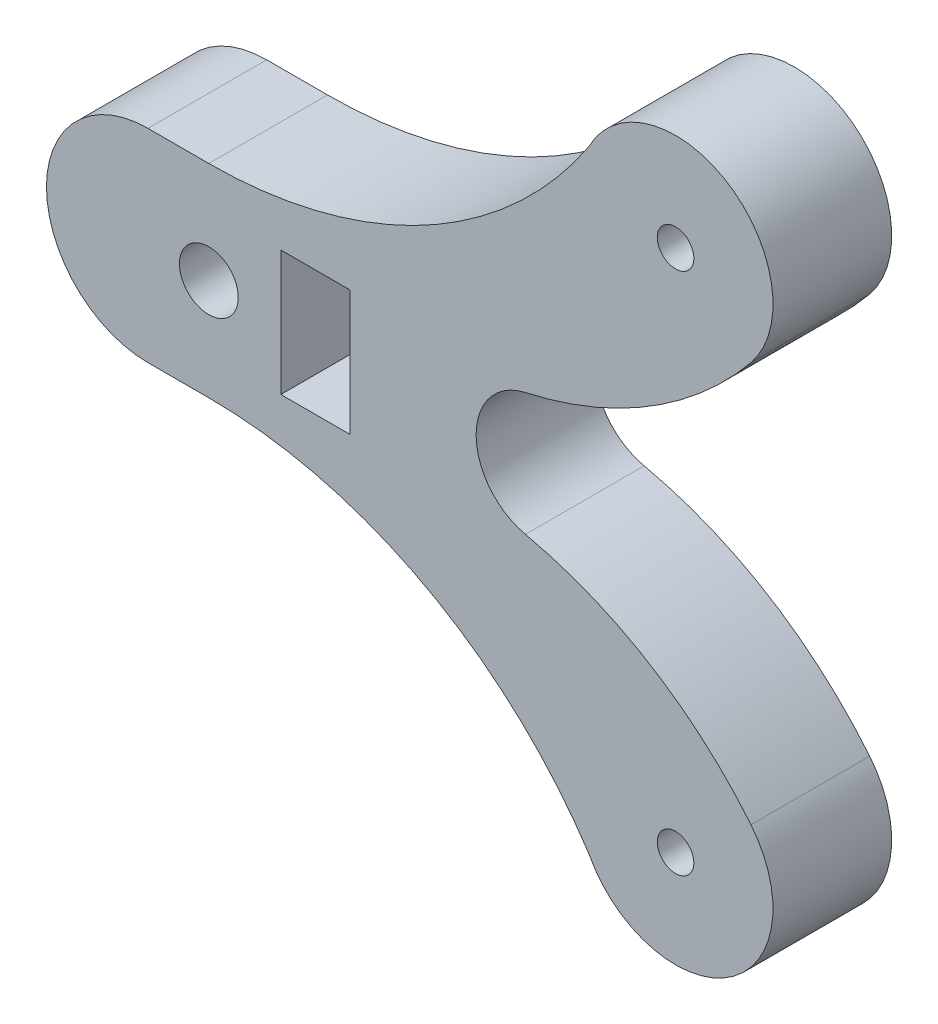
ISO-10303-21;
HEADER;
FILE_DESCRIPTION(('STEP AP214'),'2;1');
FILE_NAME('part.step','',(''),(''),'','','');
FILE_SCHEMA(('AUTOMOTIVE_DESIGN { 1 0 10303 214 1 1 1 1 }'));
ENDSEC;
DATA;
#1=APPLICATION_CONTEXT('core data for automotive mechanical design processes');
#2=APPLICATION_PROTOCOL_DEFINITION('international standard','automotive_design',2000,#1);
#3=PRODUCT_CONTEXT('',#1,'mechanical');
#4=PRODUCT('Part','Part','',(#3));
#5=PRODUCT_RELATED_PRODUCT_CATEGORY('part','',(#4));
#6=PRODUCT_DEFINITION_FORMATION('','',#4);
#7=PRODUCT_DEFINITION_CONTEXT('part definition',#1,'design');
#8=PRODUCT_DEFINITION('design','',#6,#7);
#9=PRODUCT_DEFINITION_SHAPE('','',#8);
#10=(LENGTH_UNIT() NAMED_UNIT(*) SI_UNIT(.MILLI.,.METRE.));
#11=(NAMED_UNIT(*) PLANE_ANGLE_UNIT() SI_UNIT($,.RADIAN.));
#12=(NAMED_UNIT(*) SI_UNIT($,.STERADIAN.) SOLID_ANGLE_UNIT());
#13=UNCERTAINTY_MEASURE_WITH_UNIT(LENGTH_MEASURE(1.E-05),#10,'distance_accuracy_value','');
#14=(GEOMETRIC_REPRESENTATION_CONTEXT(3) GLOBAL_UNCERTAINTY_ASSIGNED_CONTEXT((#13)) GLOBAL_UNIT_ASSIGNED_CONTEXT((#10,
#11,#12)) REPRESENTATION_CONTEXT('',''));
#15=CARTESIAN_POINT('',(0.,0.,0.));
#16=DIRECTION('',(0.,0.,1.));
#17=DIRECTION('',(1.,0.,0.));
#18=AXIS2_PLACEMENT_3D('',#15,#16,#17);
#19=CARTESIAN_POINT('',(588.919699582057,407.939803553498,5.85));
#20=DIRECTION('',(0.,0.,-1.));
#21=DIRECTION('',(-1.,0.,0.));
#22=AXIS2_PLACEMENT_3D('',#19,#20,#21);
#23=PLANE('',#22);
#24=CARTESIAN_POINT('',(588.919699582057,435.365819013464,5.85));
#25=DIRECTION('',(0.,0.,1.));
#26=DIRECTION('',(1.,0.,0.));
#27=AXIS2_PLACEMENT_3D('',#24,#25,#26);
#28=CIRCLE('',#27,1.44981300000002);
#29=CARTESIAN_POINT('',(590.369512582057,435.365819013464,5.85));
#30=VERTEX_POINT('',#29);
#31=EDGE_CURVE('E172',#30,#30,#28,.T.);
#32=ORIENTED_EDGE('',*,*,#31,.F.);
#33=EDGE_LOOP('',(#32));
#34=FACE_BOUND('',#33,.T.);
#35=CARTESIAN_POINT('',(611.919699582057,422.465819013464,5.85));
#36=DIRECTION('',(0.,0.,1.));
#37=DIRECTION('',(1.,0.,0.));
#38=AXIS2_PLACEMENT_3D('',#35,#36,#37);
#39=CIRCLE('',#38,0.900000000000007);
#40=CARTESIAN_POINT('',(612.819699582057,422.465819013464,5.85));
#41=VERTEX_POINT('',#40);
#42=EDGE_CURVE('E178',#41,#41,#39,.T.);
#43=ORIENTED_EDGE('',*,*,#42,.F.);
#44=EDGE_LOOP('',(#43));
#45=FACE_BOUND('',#44,.T.);
#46=CARTESIAN_POINT('',(611.919699582057,448.265819013464,5.85));
#47=DIRECTION('',(0.,0.,1.));
#48=DIRECTION('',(1.,0.,0.));
#49=AXIS2_PLACEMENT_3D('',#46,#47,#48);
#50=CIRCLE('',#49,0.900000000000007);
#51=CARTESIAN_POINT('',(612.819699582057,448.265819013464,5.85));
#52=VERTEX_POINT('',#51);
#53=EDGE_CURVE('E184',#52,#52,#50,.T.);
#54=ORIENTED_EDGE('',*,*,#53,.F.);
#55=EDGE_LOOP('',(#54));
#56=FACE_BOUND('',#55,.T.);
#57=CARTESIAN_POINT('',(588.919699582057,407.939803553498,5.85));
#58=DIRECTION('',(0.,0.,-1.));
#59=DIRECTION('',(-1.,0.,0.));
#60=AXIS2_PLACEMENT_3D('',#57,#58,#59);
#61=CIRCLE('',#60,22.4260154599657);
#62=CARTESIAN_POINT('',(588.919699582057,430.365819013464,5.85));
#63=VERTEX_POINT('',#62);
#64=CARTESIAN_POINT('',(607.649897060832,420.272924481175,5.85));
#65=VERTEX_POINT('',#64);
#66=EDGE_CURVE('E190',#63,#65,#61,.T.);
#67=ORIENTED_EDGE('',*,*,#66,.T.);
#68=CARTESIAN_POINT('',(611.919699582057,422.465819013464,5.85));
#69=DIRECTION('',(0.,0.,1.));
#70=DIRECTION('',(1.,0.,0.));
#71=AXIS2_PLACEMENT_3D('',#68,#69,#70);
#72=CIRCLE('',#71,4.79999999999999);
#73=CARTESIAN_POINT('',(615.634267587279,425.505882258625,5.85));
#74=VERTEX_POINT('',#73);
#75=EDGE_CURVE('E193',#65,#74,#72,.T.);
#76=ORIENTED_EDGE('',*,*,#75,.T.);
#77=CARTESIAN_POINT('',(600.219995385918,412.890589631222,5.85));
#78=DIRECTION('',(0.,0.,1.));
#79=DIRECTION('',(-1.,0.,0.));
#80=AXIS2_PLACEMENT_3D('',#77,#78,#79);
#81=CIRCLE('',#80,19.9184687055168);
#82=CARTESIAN_POINT('',(604.521800573852,432.338979479683,5.85));
#83=VERTEX_POINT('',#82);
#84=EDGE_CURVE('E196',#74,#83,#81,.T.);
#85=ORIENTED_EDGE('',*,*,#84,.T.);
#86=CARTESIAN_POINT('',(605.191309675167,435.365819013464,5.85));
#87=DIRECTION('',(0.,0.,-1.));
#88=DIRECTION('',(1.,0.,0.));
#89=AXIS2_PLACEMENT_3D('',#86,#87,#88);
#90=CIRCLE('',#89,3.09999999999995);
#91=CARTESIAN_POINT('',(604.521800573852,438.392658547244,5.85));
#92=VERTEX_POINT('',#91);
#93=EDGE_CURVE('E198',#83,#92,#90,.T.);
#94=ORIENTED_EDGE('',*,*,#93,.T.);
#95=CARTESIAN_POINT('',(600.219995385918,457.841048395705,5.85));
#96=DIRECTION('',(0.,0.,1.));
#97=DIRECTION('',(1.,0.,0.));
#98=AXIS2_PLACEMENT_3D('',#95,#96,#97);
#99=CIRCLE('',#98,19.9184687055169);
#100=CARTESIAN_POINT('',(615.634267587279,445.225755768303,5.85));
#101=VERTEX_POINT('',#100);
#102=EDGE_CURVE('E200',#92,#101,#99,.T.);
#103=ORIENTED_EDGE('',*,*,#102,.T.);
#104=CARTESIAN_POINT('',(611.919699582057,448.265819013464,5.85));
#105=DIRECTION('',(0.,0.,1.));
#106=DIRECTION('',(-1.,0.,0.));
#107=AXIS2_PLACEMENT_3D('',#104,#105,#106);
#108=CIRCLE('',#107,4.80000000000001);
#109=CARTESIAN_POINT('',(607.649897060832,450.458713545752,5.85));
#110=VERTEX_POINT('',#109);
#111=EDGE_CURVE('E202',#101,#110,#108,.T.);
#112=ORIENTED_EDGE('',*,*,#111,.T.);
#113=CARTESIAN_POINT('',(588.919699582057,462.79183447343,5.85));
#114=DIRECTION('',(0.,0.,-1.));
#115=DIRECTION('',(1.,0.,0.));
#116=AXIS2_PLACEMENT_3D('',#113,#114,#115);
#117=CIRCLE('',#116,22.4260154599657);
#118=CARTESIAN_POINT('',(588.919699582057,440.365819013464,5.85));
#119=VERTEX_POINT('',#118);
#120=EDGE_CURVE('E204',#110,#119,#117,.T.);
#121=ORIENTED_EDGE('',*,*,#120,.T.);
#122=DIRECTION('',(-1.,0.,0.));
#123=VECTOR('',#122,1.);
#124=CARTESIAN_POINT('',(588.919699582057,440.365819013464,5.85));
#125=LINE('',#124,#123);
#126=CARTESIAN_POINT('',(585.919699582057,440.365819013464,5.85));
#127=VERTEX_POINT('',#126);
#128=EDGE_CURVE('E206',#119,#127,#125,.T.);
#129=ORIENTED_EDGE('',*,*,#128,.T.);
#130=CARTESIAN_POINT('',(585.919699582057,435.365819013464,5.85));
#131=DIRECTION('',(0.,0.,1.));
#132=DIRECTION('',(1.,0.,0.));
#133=AXIS2_PLACEMENT_3D('',#130,#131,#132);
#134=CIRCLE('',#133,5.);
#135=CARTESIAN_POINT('',(585.919699582057,430.365819013464,5.85));
#136=VERTEX_POINT('',#135);
#137=EDGE_CURVE('E208',#127,#136,#134,.T.);
#138=ORIENTED_EDGE('',*,*,#137,.T.);
#139=DIRECTION('',(1.,0.,0.));
#140=VECTOR('',#139,1.);
#141=CARTESIAN_POINT('',(588.919699582057,430.365819013464,5.85));
#142=LINE('',#141,#140);
#143=EDGE_CURVE('E210',#136,#63,#142,.T.);
#144=ORIENTED_EDGE('',*,*,#143,.T.);
#145=EDGE_LOOP('',(#67,#76,#85,#94,#103,#112,#121,#129,#138,#144));
#146=FACE_BOUND('',#145,.T.);
#147=DIRECTION('',(0.,-1.,0.));
#148=VECTOR('',#147,1.);
#149=CARTESIAN_POINT('',(592.469512582057,432.283319013464,5.85));
#150=LINE('',#149,#148);
#151=CARTESIAN_POINT('',(592.469512582057,438.448319013464,5.85));
#152=VERTEX_POINT('',#151);
#153=CARTESIAN_POINT('',(592.469512582057,432.283319013464,5.85));
#154=VERTEX_POINT('',#153);
#155=EDGE_CURVE('E136',#152,#154,#150,.T.);
#156=ORIENTED_EDGE('',*,*,#155,.F.);
#157=DIRECTION('',(-1.,0.,0.));
#158=VECTOR('',#157,1.);
#159=CARTESIAN_POINT('',(592.469512582057,438.448319013464,5.85));
#160=LINE('',#159,#158);
#161=CARTESIAN_POINT('',(595.869523582057,438.448319013464,5.85));
#162=VERTEX_POINT('',#161);
#163=EDGE_CURVE('E158',#162,#152,#160,.T.);
#164=ORIENTED_EDGE('',*,*,#163,.F.);
#165=DIRECTION('',(0.,1.,0.));
#166=VECTOR('',#165,1.);
#167=CARTESIAN_POINT('',(595.869523582057,438.448319013464,5.85));
#168=LINE('',#167,#166);
#169=CARTESIAN_POINT('',(595.869523582057,432.283319013464,5.85));
#170=VERTEX_POINT('',#169);
#171=EDGE_CURVE('E156',#170,#162,#168,.T.);
#172=ORIENTED_EDGE('',*,*,#171,.F.);
#173=DIRECTION('',(1.,0.,0.));
#174=VECTOR('',#173,1.);
#175=CARTESIAN_POINT('',(595.869523582057,432.283319013464,5.85));
#176=LINE('',#175,#174);
#177=EDGE_CURVE('E144',#154,#170,#176,.T.);
#178=ORIENTED_EDGE('',*,*,#177,.F.);
#179=EDGE_LOOP('',(#156,#164,#172,#178));
#180=FACE_BOUND('',#179,.T.);
#181=ADVANCED_FACE('F35',(#34,#45,#56,#146,#180),#23,.F.);
#182=CARTESIAN_POINT('',(588.919699582057,407.939803553498,0.));
#183=DIRECTION('',(0.,0.,-1.));
#184=DIRECTION('',(-1.,0.,0.));
#185=AXIS2_PLACEMENT_3D('',#182,#183,#184);
#186=PLANE('',#185);
#187=CARTESIAN_POINT('',(611.919699582057,422.465819013464,0.));
#188=DIRECTION('',(0.,0.,1.));
#189=DIRECTION('',(1.,0.,0.));
#190=AXIS2_PLACEMENT_3D('',#187,#188,#189);
#191=CIRCLE('',#190,0.900000000000007);
#192=CARTESIAN_POINT('',(612.819699582057,422.465819013464,0.));
#193=VERTEX_POINT('',#192);
#194=EDGE_CURVE('E175',#193,#193,#191,.T.);
#195=ORIENTED_EDGE('',*,*,#194,.T.);
#196=EDGE_LOOP('',(#195));
#197=FACE_BOUND('',#196,.T.);
#198=CARTESIAN_POINT('',(588.919699582057,407.939803553498,0.));
#199=DIRECTION('',(0.,0.,-1.));
#200=DIRECTION('',(-1.,0.,0.));
#201=AXIS2_PLACEMENT_3D('',#198,#199,#200);
#202=CIRCLE('',#201,22.4260154599657);
#203=CARTESIAN_POINT('',(588.919699582057,430.365819013464,0.));
#204=VERTEX_POINT('',#203);
#205=CARTESIAN_POINT('',(607.649897060832,420.272924481175,0.));
#206=VERTEX_POINT('',#205);
#207=EDGE_CURVE('E187',#204,#206,#202,.T.);
#208=ORIENTED_EDGE('',*,*,#207,.F.);
#209=DIRECTION('',(1.,0.,0.));
#210=VECTOR('',#209,1.);
#211=CARTESIAN_POINT('',(588.919699582057,430.365819013464,0.));
#212=LINE('',#211,#210);
#213=CARTESIAN_POINT('',(585.919699582057,430.365819013464,0.));
#214=VERTEX_POINT('',#213);
#215=EDGE_CURVE('E194',#214,#204,#212,.T.);
#216=ORIENTED_EDGE('',*,*,#215,.F.);
#217=CARTESIAN_POINT('',(585.919699582057,435.365819013464,0.));
#218=DIRECTION('',(0.,0.,1.));
#219=DIRECTION('',(1.,0.,0.));
#220=AXIS2_PLACEMENT_3D('',#217,#218,#219);
#221=CIRCLE('',#220,5.);
#222=CARTESIAN_POINT('',(585.919699582057,440.365819013464,0.));
#223=VERTEX_POINT('',#222);
#224=EDGE_CURVE('E229',#223,#214,#221,.T.);
#225=ORIENTED_EDGE('',*,*,#224,.F.);
#226=DIRECTION('',(-1.,0.,0.));
#227=VECTOR('',#226,1.);
#228=CARTESIAN_POINT('',(588.919699582057,440.365819013464,0.));
#229=LINE('',#228,#227);
#230=CARTESIAN_POINT('',(588.919699582057,440.365819013464,0.));
#231=VERTEX_POINT('',#230);
#232=EDGE_CURVE('E227',#231,#223,#229,.T.);
#233=ORIENTED_EDGE('',*,*,#232,.F.);
#234=CARTESIAN_POINT('',(588.919699582057,462.79183447343,0.));
#235=DIRECTION('',(0.,0.,-1.));
#236=DIRECTION('',(1.,0.,0.));
#237=AXIS2_PLACEMENT_3D('',#234,#235,#236);
#238=CIRCLE('',#237,22.4260154599657);
#239=CARTESIAN_POINT('',(607.649897060832,450.458713545752,0.));
#240=VERTEX_POINT('',#239);
#241=EDGE_CURVE('E225',#240,#231,#238,.T.);
#242=ORIENTED_EDGE('',*,*,#241,.F.);
#243=CARTESIAN_POINT('',(611.919699582057,448.265819013464,0.));
#244=DIRECTION('',(0.,0.,1.));
#245=DIRECTION('',(-1.,0.,0.));
#246=AXIS2_PLACEMENT_3D('',#243,#244,#245);
#247=CIRCLE('',#246,4.80000000000001);
#248=CARTESIAN_POINT('',(615.634267587279,445.225755768303,0.));
#249=VERTEX_POINT('',#248);
#250=EDGE_CURVE('E223',#249,#240,#247,.T.);
#251=ORIENTED_EDGE('',*,*,#250,.F.);
#252=CARTESIAN_POINT('',(600.219995385918,457.841048395705,0.));
#253=DIRECTION('',(0.,0.,1.));
#254=DIRECTION('',(1.,0.,0.));
#255=AXIS2_PLACEMENT_3D('',#252,#253,#254);
#256=CIRCLE('',#255,19.9184687055169);
#257=CARTESIAN_POINT('',(604.521800573852,438.392658547244,0.));
#258=VERTEX_POINT('',#257);
#259=EDGE_CURVE('E221',#258,#249,#256,.T.);
#260=ORIENTED_EDGE('',*,*,#259,.F.);
#261=CARTESIAN_POINT('',(605.191309675167,435.365819013464,0.));
#262=DIRECTION('',(0.,0.,-1.));
#263=DIRECTION('',(1.,0.,0.));
#264=AXIS2_PLACEMENT_3D('',#261,#262,#263);
#265=CIRCLE('',#264,3.09999999999995);
#266=CARTESIAN_POINT('',(604.521800573852,432.338979479683,0.));
#267=VERTEX_POINT('',#266);
#268=EDGE_CURVE('E219',#267,#258,#265,.T.);
#269=ORIENTED_EDGE('',*,*,#268,.F.);
#270=CARTESIAN_POINT('',(600.219995385918,412.890589631222,0.));
#271=DIRECTION('',(0.,0.,1.));
#272=DIRECTION('',(-1.,0.,0.));
#273=AXIS2_PLACEMENT_3D('',#270,#271,#272);
#274=CIRCLE('',#273,19.9184687055168);
#275=CARTESIAN_POINT('',(615.634267587279,425.505882258625,0.));
#276=VERTEX_POINT('',#275);
#277=EDGE_CURVE('E217',#276,#267,#274,.T.);
#278=ORIENTED_EDGE('',*,*,#277,.F.);
#279=CARTESIAN_POINT('',(611.919699582057,422.465819013464,0.));
#280=DIRECTION('',(0.,0.,1.));
#281=DIRECTION('',(1.,0.,0.));
#282=AXIS2_PLACEMENT_3D('',#279,#280,#281);
#283=CIRCLE('',#282,4.79999999999999);
#284=EDGE_CURVE('E215',#206,#276,#283,.T.);
#285=ORIENTED_EDGE('',*,*,#284,.F.);
#286=EDGE_LOOP('',(#208,#216,#225,#233,#242,#251,#260,#269,#278,#285));
#287=FACE_BOUND('',#286,.T.);
#288=CARTESIAN_POINT('',(611.919699582057,448.265819013464,0.));
#289=DIRECTION('',(0.,0.,1.));
#290=DIRECTION('',(1.,0.,0.));
#291=AXIS2_PLACEMENT_3D('',#288,#289,#290);
#292=CIRCLE('',#291,0.900000000000007);
#293=CARTESIAN_POINT('',(612.819699582057,448.265819013464,0.));
#294=VERTEX_POINT('',#293);
#295=EDGE_CURVE('E181',#294,#294,#292,.T.);
#296=ORIENTED_EDGE('',*,*,#295,.T.);
#297=EDGE_LOOP('',(#296));
#298=FACE_BOUND('',#297,.T.);
#299=CARTESIAN_POINT('',(588.919699582057,435.365819013464,0.));
#300=DIRECTION('',(0.,0.,1.));
#301=DIRECTION('',(1.,0.,0.));
#302=AXIS2_PLACEMENT_3D('',#299,#300,#301);
#303=CIRCLE('',#302,1.44981300000002);
#304=CARTESIAN_POINT('',(590.369512582057,435.365819013464,0.));
#305=VERTEX_POINT('',#304);
#306=EDGE_CURVE('E152',#305,#305,#303,.T.);
#307=ORIENTED_EDGE('',*,*,#306,.T.);
#308=EDGE_LOOP('',(#307));
#309=FACE_BOUND('',#308,.T.);
#310=DIRECTION('',(-1.,0.,0.));
#311=VECTOR('',#310,1.);
#312=CARTESIAN_POINT('',(592.469512582057,438.448319013464,0.));
#313=LINE('',#312,#311);
#314=CARTESIAN_POINT('',(595.869523582057,438.448319013464,0.));
#315=VERTEX_POINT('',#314);
#316=CARTESIAN_POINT('',(592.469512582057,438.448319013464,0.));
#317=VERTEX_POINT('',#316);
#318=EDGE_CURVE('E145',#315,#317,#313,.T.);
#319=ORIENTED_EDGE('',*,*,#318,.T.);
#320=DIRECTION('',(0.,-1.,0.));
#321=VECTOR('',#320,1.);
#322=CARTESIAN_POINT('',(592.469512582057,432.283319013464,0.));
#323=LINE('',#322,#321);
#324=CARTESIAN_POINT('',(592.469512582057,432.283319013464,0.));
#325=VERTEX_POINT('',#324);
#326=EDGE_CURVE('E58',#317,#325,#323,.T.);
#327=ORIENTED_EDGE('',*,*,#326,.T.);
#328=DIRECTION('',(1.,0.,0.));
#329=VECTOR('',#328,1.);
#330=CARTESIAN_POINT('',(595.869523582057,432.283319013464,0.));
#331=LINE('',#330,#329);
#332=CARTESIAN_POINT('',(595.869523582057,432.283319013464,0.));
#333=VERTEX_POINT('',#332);
#334=EDGE_CURVE('E151',#325,#333,#331,.T.);
#335=ORIENTED_EDGE('',*,*,#334,.T.);
#336=DIRECTION('',(0.,1.,0.));
#337=VECTOR('',#336,1.);
#338=CARTESIAN_POINT('',(595.869523582057,438.448319013464,0.));
#339=LINE('',#338,#337);
#340=EDGE_CURVE('E164',#333,#315,#339,.T.);
#341=ORIENTED_EDGE('',*,*,#340,.T.);
#342=EDGE_LOOP('',(#319,#327,#335,#341));
#343=FACE_BOUND('',#342,.T.);
#344=ADVANCED_FACE('F265',(#197,#287,#298,#309,#343),#186,.T.);
#345=CARTESIAN_POINT('',(588.919699582057,407.939803553498,5.85));
#346=DIRECTION('',(0.,0.,-1.));
#347=DIRECTION('',(-1.,0.,0.));
#348=AXIS2_PLACEMENT_3D('',#345,#346,#347);
#349=CYLINDRICAL_SURFACE('',#348,22.4260154599657);
#350=ORIENTED_EDGE('',*,*,#207,.T.);
#351=DIRECTION('',(0.,0.,-1.));
#352=VECTOR('',#351,1.);
#353=CARTESIAN_POINT('',(607.649897060832,420.272924481175,5.85));
#354=LINE('',#353,#352);
#355=EDGE_CURVE('E11',#65,#206,#354,.T.);
#356=ORIENTED_EDGE('',*,*,#355,.F.);
#357=ORIENTED_EDGE('',*,*,#66,.F.);
#358=DIRECTION('',(0.,0.,-1.));
#359=VECTOR('',#358,1.);
#360=CARTESIAN_POINT('',(588.919699582057,430.365819013464,5.85));
#361=LINE('',#360,#359);
#362=EDGE_CURVE('E212',#63,#204,#361,.T.);
#363=ORIENTED_EDGE('',*,*,#362,.T.);
#364=EDGE_LOOP('',(#350,#356,#357,#363));
#365=FACE_BOUND('',#364,.T.);
#366=ADVANCED_FACE('F37',(#365),#349,.F.);
#367=CARTESIAN_POINT('',(611.919699582057,422.465819013464,5.85));
#368=DIRECTION('',(0.,0.,-1.));
#369=DIRECTION('',(-1.,0.,0.));
#370=AXIS2_PLACEMENT_3D('',#367,#368,#369);
#371=CYLINDRICAL_SURFACE('',#370,4.79999999999999);
#372=ORIENTED_EDGE('',*,*,#284,.T.);
#373=DIRECTION('',(0.,0.,-1.));
#374=VECTOR('',#373,1.);
#375=CARTESIAN_POINT('',(615.634267587279,425.505882258625,5.85));
#376=LINE('',#375,#374);
#377=EDGE_CURVE('E43',#74,#276,#376,.T.);
#378=ORIENTED_EDGE('',*,*,#377,.F.);
#379=ORIENTED_EDGE('',*,*,#75,.F.);
#380=ORIENTED_EDGE('',*,*,#355,.T.);
#381=EDGE_LOOP('',(#372,#378,#379,#380));
#382=FACE_BOUND('',#381,.T.);
#383=ADVANCED_FACE('F282',(#382),#371,.T.);
#384=CARTESIAN_POINT('',(600.219995385918,412.890589631222,5.85));
#385=DIRECTION('',(0.,0.,-1.));
#386=DIRECTION('',(-1.,0.,0.));
#387=AXIS2_PLACEMENT_3D('',#384,#385,#386);
#388=CYLINDRICAL_SURFACE('',#387,19.9184687055168);
#389=ORIENTED_EDGE('',*,*,#277,.T.);
#390=DIRECTION('',(0.,0.,-1.));
#391=VECTOR('',#390,1.);
#392=CARTESIAN_POINT('',(604.521800573852,432.338979479683,5.85));
#393=LINE('',#392,#391);
#394=EDGE_CURVE('E252',#83,#267,#393,.T.);
#395=ORIENTED_EDGE('',*,*,#394,.F.);
#396=ORIENTED_EDGE('',*,*,#84,.F.);
#397=ORIENTED_EDGE('',*,*,#377,.T.);
#398=EDGE_LOOP('',(#389,#395,#396,#397));
#399=FACE_BOUND('',#398,.T.);
#400=ADVANCED_FACE('F259',(#399),#388,.T.);
#401=CARTESIAN_POINT('',(605.191309675167,435.365819013464,5.85));
#402=DIRECTION('',(0.,0.,-1.));
#403=DIRECTION('',(-1.,0.,0.));
#404=AXIS2_PLACEMENT_3D('',#401,#402,#403);
#405=CYLINDRICAL_SURFACE('',#404,3.09999999999995);
#406=ORIENTED_EDGE('',*,*,#268,.T.);
#407=DIRECTION('',(0.,0.,-1.));
#408=VECTOR('',#407,1.);
#409=CARTESIAN_POINT('',(604.521800573852,438.392658547244,5.85));
#410=LINE('',#409,#408);
#411=EDGE_CURVE('E249',#92,#258,#410,.T.);
#412=ORIENTED_EDGE('',*,*,#411,.F.);
#413=ORIENTED_EDGE('',*,*,#93,.F.);
#414=ORIENTED_EDGE('',*,*,#394,.T.);
#415=EDGE_LOOP('',(#406,#412,#413,#414));
#416=FACE_BOUND('',#415,.T.);
#417=ADVANCED_FACE('F271',(#416),#405,.F.);
#418=CARTESIAN_POINT('',(600.219995385918,457.841048395705,5.85));
#419=DIRECTION('',(0.,0.,-1.));
#420=DIRECTION('',(-1.,0.,0.));
#421=AXIS2_PLACEMENT_3D('',#418,#419,#420);
#422=CYLINDRICAL_SURFACE('',#421,19.9184687055169);
#423=ORIENTED_EDGE('',*,*,#259,.T.);
#424=DIRECTION('',(0.,0.,-1.));
#425=VECTOR('',#424,1.);
#426=CARTESIAN_POINT('',(615.634267587279,445.225755768303,5.85));
#427=LINE('',#426,#425);
#428=EDGE_CURVE('E246',#101,#249,#427,.T.);
#429=ORIENTED_EDGE('',*,*,#428,.F.);
#430=ORIENTED_EDGE('',*,*,#102,.F.);
#431=ORIENTED_EDGE('',*,*,#411,.T.);
#432=EDGE_LOOP('',(#423,#429,#430,#431));
#433=FACE_BOUND('',#432,.T.);
#434=ADVANCED_FACE('F275',(#433),#422,.T.);
#435=CARTESIAN_POINT('',(611.919699582057,448.265819013464,5.85));
#436=DIRECTION('',(0.,0.,-1.));
#437=DIRECTION('',(-1.,0.,0.));
#438=AXIS2_PLACEMENT_3D('',#435,#436,#437);
#439=CYLINDRICAL_SURFACE('',#438,4.80000000000001);
#440=ORIENTED_EDGE('',*,*,#250,.T.);
#441=DIRECTION('',(0.,0.,-1.));
#442=VECTOR('',#441,1.);
#443=CARTESIAN_POINT('',(607.649897060832,450.458713545752,5.85));
#444=LINE('',#443,#442);
#445=EDGE_CURVE('E243',#110,#240,#444,.T.);
#446=ORIENTED_EDGE('',*,*,#445,.F.);
#447=ORIENTED_EDGE('',*,*,#111,.F.);
#448=ORIENTED_EDGE('',*,*,#428,.T.);
#449=EDGE_LOOP('',(#440,#446,#447,#448));
#450=FACE_BOUND('',#449,.T.);
#451=ADVANCED_FACE('F305',(#450),#439,.T.);
#452=CARTESIAN_POINT('',(588.919699582057,462.79183447343,5.85));
#453=DIRECTION('',(0.,0.,-1.));
#454=DIRECTION('',(-1.,0.,0.));
#455=AXIS2_PLACEMENT_3D('',#452,#453,#454);
#456=CYLINDRICAL_SURFACE('',#455,22.4260154599657);
#457=ORIENTED_EDGE('',*,*,#241,.T.);
#458=DIRECTION('',(0.,0.,-1.));
#459=VECTOR('',#458,1.);
#460=CARTESIAN_POINT('',(588.919699582057,440.365819013464,5.85));
#461=LINE('',#460,#459);
#462=EDGE_CURVE('E240',#119,#231,#461,.T.);
#463=ORIENTED_EDGE('',*,*,#462,.F.);
#464=ORIENTED_EDGE('',*,*,#120,.F.);
#465=ORIENTED_EDGE('',*,*,#445,.T.);
#466=EDGE_LOOP('',(#457,#463,#464,#465));
#467=FACE_BOUND('',#466,.T.);
#468=ADVANCED_FACE('F302',(#467),#456,.F.);
#469=CARTESIAN_POINT('',(588.919699582057,440.365819013464,5.85));
#470=DIRECTION('',(0.,-1.,0.));
#471=DIRECTION('',(0.,0.,-1.));
#472=AXIS2_PLACEMENT_3D('',#469,#470,#471);
#473=PLANE('',#472);
#474=ORIENTED_EDGE('',*,*,#232,.T.);
#475=DIRECTION('',(0.,0.,-1.));
#476=VECTOR('',#475,1.);
#477=CARTESIAN_POINT('',(585.919699582057,440.365819013464,5.85));
#478=LINE('',#477,#476);
#479=EDGE_CURVE('E237',#127,#223,#478,.T.);
#480=ORIENTED_EDGE('',*,*,#479,.F.);
#481=ORIENTED_EDGE('',*,*,#128,.F.);
#482=ORIENTED_EDGE('',*,*,#462,.T.);
#483=EDGE_LOOP('',(#474,#480,#481,#482));
#484=FACE_BOUND('',#483,.T.);
#485=ADVANCED_FACE('F298',(#484),#473,.F.);
#486=CARTESIAN_POINT('',(585.919699582057,435.365819013464,5.85));
#487=DIRECTION('',(0.,0.,-1.));
#488=DIRECTION('',(-1.,0.,0.));
#489=AXIS2_PLACEMENT_3D('',#486,#487,#488);
#490=CYLINDRICAL_SURFACE('',#489,5.);
#491=ORIENTED_EDGE('',*,*,#224,.T.);
#492=DIRECTION('',(0.,0.,-1.));
#493=VECTOR('',#492,1.);
#494=CARTESIAN_POINT('',(585.919699582057,430.365819013464,5.85));
#495=LINE('',#494,#493);
#496=EDGE_CURVE('E234',#136,#214,#495,.T.);
#497=ORIENTED_EDGE('',*,*,#496,.F.);
#498=ORIENTED_EDGE('',*,*,#137,.F.);
#499=ORIENTED_EDGE('',*,*,#479,.T.);
#500=EDGE_LOOP('',(#491,#497,#498,#499));
#501=FACE_BOUND('',#500,.T.);
#502=ADVANCED_FACE('F294',(#501),#490,.T.);
#503=CARTESIAN_POINT('',(588.919699582057,430.365819013464,5.85));
#504=DIRECTION('',(0.,1.,0.));
#505=DIRECTION('',(0.,0.,1.));
#506=AXIS2_PLACEMENT_3D('',#503,#504,#505);
#507=PLANE('',#506);
#508=ORIENTED_EDGE('',*,*,#215,.T.);
#509=ORIENTED_EDGE('',*,*,#362,.F.);
#510=ORIENTED_EDGE('',*,*,#143,.F.);
#511=ORIENTED_EDGE('',*,*,#496,.T.);
#512=EDGE_LOOP('',(#508,#509,#510,#511));
#513=FACE_BOUND('',#512,.T.);
#514=ADVANCED_FACE('F289',(#513),#507,.F.);
#515=CARTESIAN_POINT('',(611.919699582057,448.265819013464,5.85));
#516=DIRECTION('',(0.,0.,-1.));
#517=DIRECTION('',(-1.,0.,0.));
#518=AXIS2_PLACEMENT_3D('',#515,#516,#517);
#519=CYLINDRICAL_SURFACE('',#518,0.900000000000007);
#520=ORIENTED_EDGE('',*,*,#53,.T.);
#521=EDGE_LOOP('',(#520));
#522=FACE_BOUND('',#521,.T.);
#523=ORIENTED_EDGE('',*,*,#295,.F.);
#524=EDGE_LOOP('',(#523));
#525=FACE_BOUND('',#524,.T.);
#526=ADVANCED_FACE('F325',(#522,#525),#519,.F.);
#527=CARTESIAN_POINT('',(611.919699582057,422.465819013464,5.85));
#528=DIRECTION('',(0.,0.,-1.));
#529=DIRECTION('',(-1.,0.,0.));
#530=AXIS2_PLACEMENT_3D('',#527,#528,#529);
#531=CYLINDRICAL_SURFACE('',#530,0.900000000000007);
#532=ORIENTED_EDGE('',*,*,#42,.T.);
#533=EDGE_LOOP('',(#532));
#534=FACE_BOUND('',#533,.T.);
#535=ORIENTED_EDGE('',*,*,#194,.F.);
#536=EDGE_LOOP('',(#535));
#537=FACE_BOUND('',#536,.T.);
#538=ADVANCED_FACE('F351',(#534,#537),#531,.F.);
#539=CARTESIAN_POINT('',(588.919699582057,435.365819013464,5.85));
#540=DIRECTION('',(0.,0.,-1.));
#541=DIRECTION('',(-1.,0.,0.));
#542=AXIS2_PLACEMENT_3D('',#539,#540,#541);
#543=CYLINDRICAL_SURFACE('',#542,1.44981300000002);
#544=ORIENTED_EDGE('',*,*,#31,.T.);
#545=EDGE_LOOP('',(#544));
#546=FACE_BOUND('',#545,.T.);
#547=ORIENTED_EDGE('',*,*,#306,.F.);
#548=EDGE_LOOP('',(#547));
#549=FACE_BOUND('',#548,.T.);
#550=ADVANCED_FACE('F358',(#546,#549),#543,.F.);
#551=CARTESIAN_POINT('',(592.469512582057,432.283319013464,5.85));
#552=DIRECTION('',(1.,0.,0.));
#553=DIRECTION('',(0.,0.,-1.));
#554=AXIS2_PLACEMENT_3D('',#551,#552,#553);
#555=PLANE('',#554);
#556=ORIENTED_EDGE('',*,*,#326,.F.);
#557=DIRECTION('',(0.,0.,-1.));
#558=VECTOR('',#557,1.);
#559=CARTESIAN_POINT('',(592.469512582057,438.448319013464,5.85));
#560=LINE('',#559,#558);
#561=EDGE_CURVE('E140',#152,#317,#560,.T.);
#562=ORIENTED_EDGE('',*,*,#561,.F.);
#563=ORIENTED_EDGE('',*,*,#155,.T.);
#564=DIRECTION('',(0.,0.,-1.));
#565=VECTOR('',#564,1.);
#566=CARTESIAN_POINT('',(592.469512582057,432.283319013464,5.85));
#567=LINE('',#566,#565);
#568=EDGE_CURVE('E139',#154,#325,#567,.T.);
#569=ORIENTED_EDGE('',*,*,#568,.T.);
#570=EDGE_LOOP('',(#556,#562,#563,#569));
#571=FACE_BOUND('',#570,.T.);
#572=ADVANCED_FACE('F138',(#571),#555,.T.);
#573=CARTESIAN_POINT('',(595.869523582057,432.283319013464,5.85));
#574=DIRECTION('',(0.,1.,0.));
#575=DIRECTION('',(0.,0.,1.));
#576=AXIS2_PLACEMENT_3D('',#573,#574,#575);
#577=PLANE('',#576);
#578=ORIENTED_EDGE('',*,*,#334,.F.);
#579=ORIENTED_EDGE('',*,*,#568,.F.);
#580=ORIENTED_EDGE('',*,*,#177,.T.);
#581=DIRECTION('',(0.,0.,-1.));
#582=VECTOR('',#581,1.);
#583=CARTESIAN_POINT('',(595.869523582057,432.283319013464,5.85));
#584=LINE('',#583,#582);
#585=EDGE_CURVE('E153',#170,#333,#584,.T.);
#586=ORIENTED_EDGE('',*,*,#585,.T.);
#587=EDGE_LOOP('',(#578,#579,#580,#586));
#588=FACE_BOUND('',#587,.T.);
#589=ADVANCED_FACE('F148',(#588),#577,.T.);
#590=CARTESIAN_POINT('',(595.869523582057,438.448319013464,5.85));
#591=DIRECTION('',(-1.,0.,0.));
#592=DIRECTION('',(0.,0.,1.));
#593=AXIS2_PLACEMENT_3D('',#590,#591,#592);
#594=PLANE('',#593);
#595=ORIENTED_EDGE('',*,*,#340,.F.);
#596=ORIENTED_EDGE('',*,*,#585,.F.);
#597=ORIENTED_EDGE('',*,*,#171,.T.);
#598=DIRECTION('',(0.,0.,-1.));
#599=VECTOR('',#598,1.);
#600=CARTESIAN_POINT('',(595.869523582057,438.448319013464,5.85));
#601=LINE('',#600,#599);
#602=EDGE_CURVE('E50',#162,#315,#601,.T.);
#603=ORIENTED_EDGE('',*,*,#602,.T.);
#604=EDGE_LOOP('',(#595,#596,#597,#603));
#605=FACE_BOUND('',#604,.T.);
#606=ADVANCED_FACE('F378',(#605),#594,.T.);
#607=CARTESIAN_POINT('',(592.469512582057,438.448319013464,5.85));
#608=DIRECTION('',(0.,-1.,0.));
#609=DIRECTION('',(0.,0.,-1.));
#610=AXIS2_PLACEMENT_3D('',#607,#608,#609);
#611=PLANE('',#610);
#612=ORIENTED_EDGE('',*,*,#318,.F.);
#613=ORIENTED_EDGE('',*,*,#602,.F.);
#614=ORIENTED_EDGE('',*,*,#163,.T.);
#615=ORIENTED_EDGE('',*,*,#561,.T.);
#616=EDGE_LOOP('',(#612,#613,#614,#615));
#617=FACE_BOUND('',#616,.T.);
#618=ADVANCED_FACE('F385',(#617),#611,.T.);
#619=CLOSED_SHELL('',(#181,#344,#366,#383,#400,#417,#434,#451,#468,#485,#502,#514,#526,#538,
#550,#572,#589,#606,#618));
#620=MANIFOLD_SOLID_BREP('B2',#619);
#621=ADVANCED_BREP_SHAPE_REPRESENTATION('',(#18,#620),#14);
#622=SHAPE_DEFINITION_REPRESENTATION(#9,#621);
ENDSEC;
END-ISO-10303-21;
